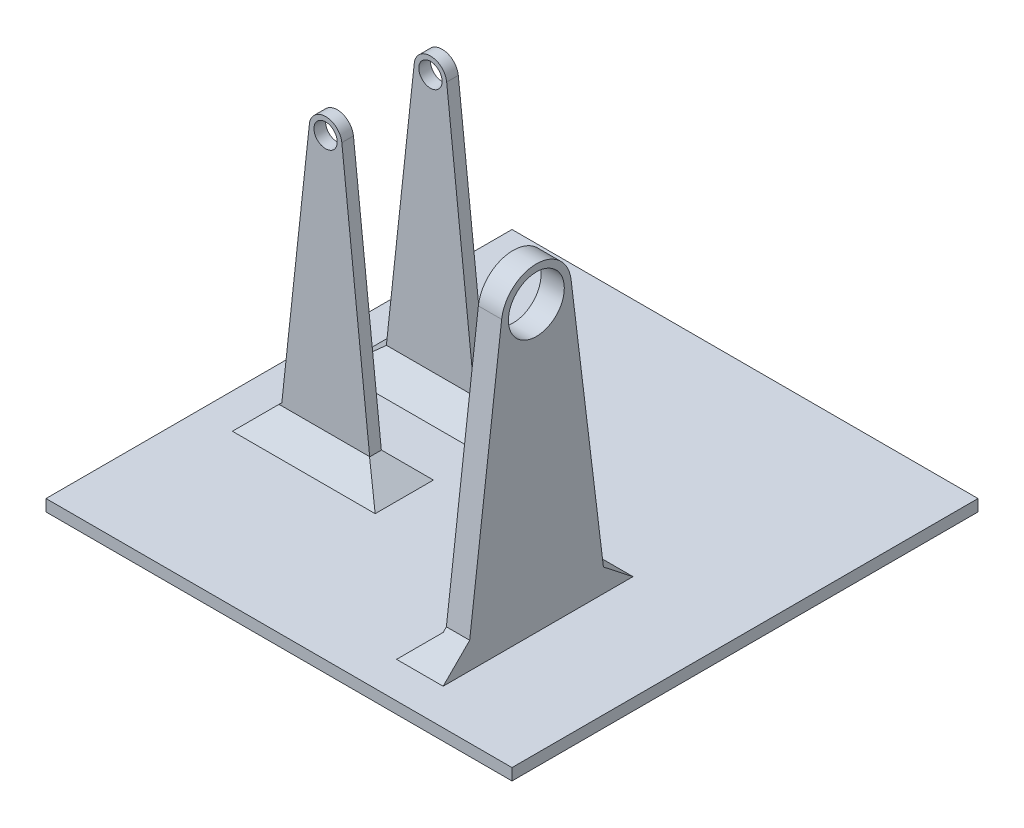
ISO-10303-21;
HEADER;
FILE_DESCRIPTION(('STEP AP214'),'2;1');
FILE_NAME('part.step','',(''),(''),'','','');
FILE_SCHEMA(('AUTOMOTIVE_DESIGN { 1 0 10303 214 1 1 1 1 }'));
ENDSEC;
DATA;
#1=APPLICATION_CONTEXT('core data for automotive mechanical design processes');
#2=APPLICATION_PROTOCOL_DEFINITION('international standard','automotive_design',2000,#1);
#3=PRODUCT_CONTEXT('',#1,'mechanical');
#4=PRODUCT('Part','Part','',(#3));
#5=PRODUCT_RELATED_PRODUCT_CATEGORY('part','',(#4));
#6=PRODUCT_DEFINITION_FORMATION('','',#4);
#7=PRODUCT_DEFINITION_CONTEXT('part definition',#1,'design');
#8=PRODUCT_DEFINITION('design','',#6,#7);
#9=PRODUCT_DEFINITION_SHAPE('','',#8);
#10=(LENGTH_UNIT() NAMED_UNIT(*) SI_UNIT(.MILLI.,.METRE.));
#11=(NAMED_UNIT(*) PLANE_ANGLE_UNIT() SI_UNIT($,.RADIAN.));
#12=(NAMED_UNIT(*) SI_UNIT($,.STERADIAN.) SOLID_ANGLE_UNIT());
#13=UNCERTAINTY_MEASURE_WITH_UNIT(LENGTH_MEASURE(1.E-05),#10,'distance_accuracy_value','');
#14=(GEOMETRIC_REPRESENTATION_CONTEXT(3) GLOBAL_UNCERTAINTY_ASSIGNED_CONTEXT((#13)) GLOBAL_UNIT_ASSIGNED_CONTEXT((#10,
#11,#12)) REPRESENTATION_CONTEXT('',''));
#15=CARTESIAN_POINT('',(0.,0.,0.));
#16=DIRECTION('',(0.,0.,1.));
#17=DIRECTION('',(1.,0.,0.));
#18=AXIS2_PLACEMENT_3D('',#15,#16,#17);
#19=CARTESIAN_POINT('',(0.,5.,0.));
#20=DIRECTION('',(0.,1.,0.));
#21=DIRECTION('',(0.,0.,1.));
#22=AXIS2_PLACEMENT_3D('',#19,#20,#21);
#23=PLANE('',#22);
#24=DIRECTION('',(0.,0.,1.));
#25=VECTOR('',#24,1.);
#26=CARTESIAN_POINT('',(118.507957149337,5.,5.22953330592103));
#27=LINE('',#26,#25);
#28=CARTESIAN_POINT('',(118.507957149337,5.,-9.77046669407893));
#29=VERTEX_POINT('',#28);
#30=CARTESIAN_POINT('',(118.507957149337,5.,15.2295333059211));
#31=VERTEX_POINT('',#30);
#32=EDGE_CURVE('E422',#29,#31,#27,.T.);
#33=ORIENTED_EDGE('',*,*,#32,.T.);
#34=DIRECTION('',(-1.,0.,0.));
#35=VECTOR('',#34,1.);
#36=CARTESIAN_POINT('',(0.,5.,15.2295333059211));
#37=LINE('',#36,#35);
#38=CARTESIAN_POINT('',(57.232084105509,5.,15.2295333059211));
#39=VERTEX_POINT('',#38);
#40=EDGE_CURVE('E431',#31,#39,#37,.T.);
#41=ORIENTED_EDGE('',*,*,#40,.T.);
#42=DIRECTION('',(0.,0.,-1.));
#43=VECTOR('',#42,1.);
#44=CARTESIAN_POINT('',(57.232084105509,5.,0.));
#45=LINE('',#44,#43);
#46=CARTESIAN_POINT('',(57.232084105509,5.,-9.77046669407893));
#47=VERTEX_POINT('',#46);
#48=EDGE_CURVE('E428',#39,#47,#45,.T.);
#49=ORIENTED_EDGE('',*,*,#48,.T.);
#50=DIRECTION('',(1.,0.,0.));
#51=VECTOR('',#50,1.);
#52=CARTESIAN_POINT('',(108.507957149337,5.,-9.77046669407893));
#53=LINE('',#52,#51);
#54=EDGE_CURVE('E425',#47,#29,#53,.T.);
#55=ORIENTED_EDGE('',*,*,#54,.T.);
#56=EDGE_LOOP('',(#33,#41,#49,#55));
#57=FACE_BOUND('',#56,.T.);
#58=DIRECTION('',(0.,0.,-1.));
#59=VECTOR('',#58,1.);
#60=CARTESIAN_POINT('',(58.5079571493369,5.,45.229533305921));
#61=LINE('',#60,#59);
#62=CARTESIAN_POINT('',(58.5079571493369,5.,60.2295333059211));
#63=VERTEX_POINT('',#62);
#64=CARTESIAN_POINT('',(58.5079571493369,5.,35.2295333059211));
#65=VERTEX_POINT('',#64);
#66=EDGE_CURVE('E415',#63,#65,#61,.T.);
#67=ORIENTED_EDGE('',*,*,#66,.T.);
#68=DIRECTION('',(1.,0.,0.));
#69=VECTOR('',#68,1.);
#70=CARTESIAN_POINT('',(0.,5.,35.2295333059211));
#71=LINE('',#70,#69);
#72=CARTESIAN_POINT('',(119.783830193165,5.,35.2295333059211));
#73=VERTEX_POINT('',#72);
#74=EDGE_CURVE('E418',#65,#73,#71,.T.);
#75=ORIENTED_EDGE('',*,*,#74,.T.);
#76=DIRECTION('',(0.,0.,1.));
#77=VECTOR('',#76,1.);
#78=CARTESIAN_POINT('',(119.783830193165,5.,0.));
#79=LINE('',#78,#77);
#80=CARTESIAN_POINT('',(119.783830193165,5.,60.2295333059211));
#81=VERTEX_POINT('',#80);
#82=EDGE_CURVE('E412',#73,#81,#79,.T.);
#83=ORIENTED_EDGE('',*,*,#82,.T.);
#84=DIRECTION('',(-1.,0.,0.));
#85=VECTOR('',#84,1.);
#86=CARTESIAN_POINT('',(68.5079571493369,5.,60.2295333059211));
#87=LINE('',#86,#85);
#88=EDGE_CURVE('E409',#81,#63,#87,.T.);
#89=ORIENTED_EDGE('',*,*,#88,.T.);
#90=EDGE_LOOP('',(#67,#75,#83,#89));
#91=FACE_BOUND('',#90,.T.);
#92=DIRECTION('',(0.,0.,-1.));
#93=VECTOR('',#92,1.);
#94=CARTESIAN_POINT('',(43.5079571493369,5.,-74.770466694079));
#95=LINE('',#94,#93);
#96=CARTESIAN_POINT('',(43.5079571493369,5.,125.229533305921));
#97=VERTEX_POINT('',#96);
#98=CARTESIAN_POINT('',(43.5079571493369,5.,-74.770466694079));
#99=VERTEX_POINT('',#98);
#100=EDGE_CURVE('E387',#97,#99,#95,.T.);
#101=ORIENTED_EDGE('',*,*,#100,.F.);
#102=DIRECTION('',(1.,0.,0.));
#103=VECTOR('',#102,1.);
#104=CARTESIAN_POINT('',(43.5079571493369,5.,125.229533305921));
#105=LINE('',#104,#103);
#106=CARTESIAN_POINT('',(243.507957149337,5.,125.229533305921));
#107=VERTEX_POINT('',#106);
#108=EDGE_CURVE('E366',#97,#107,#105,.T.);
#109=ORIENTED_EDGE('',*,*,#108,.T.);
#110=DIRECTION('',(0.,0.,-1.));
#111=VECTOR('',#110,1.);
#112=CARTESIAN_POINT('',(243.507957149337,5.,-74.770466694079));
#113=LINE('',#112,#111);
#114=CARTESIAN_POINT('',(243.507957149337,5.,-74.770466694079));
#115=VERTEX_POINT('',#114);
#116=EDGE_CURVE('E374',#107,#115,#113,.T.);
#117=ORIENTED_EDGE('',*,*,#116,.T.);
#118=DIRECTION('',(-1.,0.,0.));
#119=VECTOR('',#118,1.);
#120=CARTESIAN_POINT('',(120.27471536396,5.,-74.770466694079));
#121=LINE('',#120,#119);
#122=EDGE_CURVE('E398',#115,#99,#121,.T.);
#123=ORIENTED_EDGE('',*,*,#122,.T.);
#124=EDGE_LOOP('',(#101,#109,#117,#123));
#125=FACE_BOUND('',#124,.T.);
#126=DIRECTION('',(-1.,0.,0.));
#127=VECTOR('',#126,1.);
#128=CARTESIAN_POINT('',(188.507957149337,5.,109.779533305921));
#129=LINE('',#128,#127);
#130=CARTESIAN_POINT('',(198.507957149337,5.,109.779533305921));
#131=VERTEX_POINT('',#130);
#132=CARTESIAN_POINT('',(178.507957149337,5.,109.779533305921));
#133=VERTEX_POINT('',#132);
#134=EDGE_CURVE('E76',#131,#133,#129,.T.);
#135=ORIENTED_EDGE('',*,*,#134,.T.);
#136=DIRECTION('',(0.,0.,-1.));
#137=VECTOR('',#136,1.);
#138=CARTESIAN_POINT('',(178.507957149337,5.,0.));
#139=LINE('',#138,#137);
#140=CARTESIAN_POINT('',(178.507957149337,5.,28.3050058570068));
#141=VERTEX_POINT('',#140);
#142=EDGE_CURVE('E537',#133,#141,#139,.T.);
#143=ORIENTED_EDGE('',*,*,#142,.T.);
#144=DIRECTION('',(1.,0.,0.));
#145=VECTOR('',#144,1.);
#146=CARTESIAN_POINT('',(0.,5.,28.3050058570069));
#147=LINE('',#146,#145);
#148=CARTESIAN_POINT('',(198.507957149337,5.,28.3050058570068));
#149=VERTEX_POINT('',#148);
#150=EDGE_CURVE('E435',#141,#149,#147,.T.);
#151=ORIENTED_EDGE('',*,*,#150,.T.);
#152=DIRECTION('',(0.,0.,1.));
#153=VECTOR('',#152,1.);
#154=CARTESIAN_POINT('',(198.507957149337,5.,0.));
#155=LINE('',#154,#153);
#156=EDGE_CURVE('E279',#149,#131,#155,.T.);
#157=ORIENTED_EDGE('',*,*,#156,.T.);
#158=EDGE_LOOP('',(#135,#143,#151,#157));
#159=FACE_BOUND('',#158,.T.);
#160=ADVANCED_FACE('F52',(#57,#91,#125,#159),#23,.T.);
#161=CARTESIAN_POINT('',(0.,0.,0.));
#162=DIRECTION('',(0.,1.,0.));
#163=DIRECTION('',(0.,0.,1.));
#164=AXIS2_PLACEMENT_3D('',#161,#162,#163);
#165=PLANE('',#164);
#166=DIRECTION('',(-1.,0.,0.));
#167=VECTOR('',#166,1.);
#168=CARTESIAN_POINT('',(43.5079571493369,0.,125.229533305921));
#169=LINE('',#168,#167);
#170=CARTESIAN_POINT('',(243.507957149337,0.,125.229533305921));
#171=VERTEX_POINT('',#170);
#172=CARTESIAN_POINT('',(43.5079571493369,-1.11022302462516E-13,125.229533305921));
#173=VERTEX_POINT('',#172);
#174=EDGE_CURVE('E370',#171,#173,#169,.T.);
#175=ORIENTED_EDGE('',*,*,#174,.T.);
#176=DIRECTION('',(0.,0.,-1.));
#177=VECTOR('',#176,1.);
#178=CARTESIAN_POINT('',(43.5079571493369,0.,0.));
#179=LINE('',#178,#177);
#180=CARTESIAN_POINT('',(43.5079571493369,0.,-74.770466694079));
#181=VERTEX_POINT('',#180);
#182=EDGE_CURVE('E394',#173,#181,#179,.T.);
#183=ORIENTED_EDGE('',*,*,#182,.T.);
#184=DIRECTION('',(-1.,0.,0.));
#185=VECTOR('',#184,1.);
#186=CARTESIAN_POINT('',(120.27471536396,0.,-74.770466694079));
#187=LINE('',#186,#185);
#188=CARTESIAN_POINT('',(243.507957149337,0.,-74.770466694079));
#189=VERTEX_POINT('',#188);
#190=EDGE_CURVE('E397',#189,#181,#187,.T.);
#191=ORIENTED_EDGE('',*,*,#190,.F.);
#192=DIRECTION('',(0.,0.,1.));
#193=VECTOR('',#192,1.);
#194=CARTESIAN_POINT('',(243.507957149337,0.,-74.770466694079));
#195=LINE('',#194,#193);
#196=EDGE_CURVE('E367',#189,#171,#195,.T.);
#197=ORIENTED_EDGE('',*,*,#196,.T.);
#198=EDGE_LOOP('',(#175,#183,#191,#197));
#199=FACE_BOUND('',#198,.T.);
#200=ADVANCED_FACE('F560',(#199),#165,.F.);
#201=CARTESIAN_POINT('',(43.5079571493369,-5.,-74.770466694079));
#202=DIRECTION('',(1.,0.,0.));
#203=DIRECTION('',(0.,0.,-1.));
#204=AXIS2_PLACEMENT_3D('',#201,#202,#203);
#205=PLANE('',#204);
#206=DIRECTION('',(0.,1.,0.));
#207=VECTOR('',#206,1.);
#208=CARTESIAN_POINT('',(43.5079571493369,-1.11022302462516E-13,125.229533305921));
#209=LINE('',#208,#207);
#210=EDGE_CURVE('E360',#173,#97,#209,.T.);
#211=ORIENTED_EDGE('',*,*,#210,.T.);
#212=ORIENTED_EDGE('',*,*,#100,.T.);
#213=DIRECTION('',(0.,1.,0.));
#214=VECTOR('',#213,1.);
#215=CARTESIAN_POINT('',(43.5079571493369,-5.,-74.770466694079));
#216=LINE('',#215,#214);
#217=EDGE_CURVE('E390',#181,#99,#216,.T.);
#218=ORIENTED_EDGE('',*,*,#217,.F.);
#219=ORIENTED_EDGE('',*,*,#182,.F.);
#220=EDGE_LOOP('',(#211,#212,#218,#219));
#221=FACE_BOUND('',#220,.T.);
#222=ADVANCED_FACE('F568',(#221),#205,.F.);
#223=CARTESIAN_POINT('',(120.27471536396,5.,-74.770466694079));
#224=DIRECTION('',(0.,0.,1.));
#225=DIRECTION('',(1.,0.,0.));
#226=AXIS2_PLACEMENT_3D('',#223,#224,#225);
#227=PLANE('',#226);
#228=ORIENTED_EDGE('',*,*,#190,.T.);
#229=ORIENTED_EDGE('',*,*,#217,.T.);
#230=ORIENTED_EDGE('',*,*,#122,.F.);
#231=DIRECTION('',(0.,1.,0.));
#232=VECTOR('',#231,1.);
#233=CARTESIAN_POINT('',(243.507957149337,-282.842712474619,-74.770466694079));
#234=LINE('',#233,#232);
#235=EDGE_CURVE('E371',#189,#115,#234,.T.);
#236=ORIENTED_EDGE('',*,*,#235,.F.);
#237=EDGE_LOOP('',(#228,#229,#230,#236));
#238=FACE_BOUND('',#237,.T.);
#239=ADVANCED_FACE('F575',(#238),#227,.F.);
#240=CARTESIAN_POINT('',(243.507957149337,-282.842712474619,-74.770466694079));
#241=DIRECTION('',(1.,0.,0.));
#242=DIRECTION('',(0.,0.,-1.));
#243=AXIS2_PLACEMENT_3D('',#240,#241,#242);
#244=PLANE('',#243);
#245=ORIENTED_EDGE('',*,*,#196,.F.);
#246=ORIENTED_EDGE('',*,*,#235,.T.);
#247=ORIENTED_EDGE('',*,*,#116,.F.);
#248=DIRECTION('',(0.,1.,0.));
#249=VECTOR('',#248,1.);
#250=CARTESIAN_POINT('',(243.507957149337,-282.842712474619,125.229533305921));
#251=LINE('',#250,#249);
#252=EDGE_CURVE('E378',#171,#107,#251,.T.);
#253=ORIENTED_EDGE('',*,*,#252,.F.);
#254=EDGE_LOOP('',(#245,#246,#247,#253));
#255=FACE_BOUND('',#254,.T.);
#256=ADVANCED_FACE('F578',(#255),#244,.T.);
#257=CARTESIAN_POINT('',(43.5079571493369,-282.842712474619,125.229533305921));
#258=DIRECTION('',(0.,0.,1.));
#259=DIRECTION('',(1.,0.,0.));
#260=AXIS2_PLACEMENT_3D('',#257,#258,#259);
#261=PLANE('',#260);
#262=ORIENTED_EDGE('',*,*,#108,.F.);
#263=ORIENTED_EDGE('',*,*,#210,.F.);
#264=ORIENTED_EDGE('',*,*,#174,.F.);
#265=ORIENTED_EDGE('',*,*,#252,.T.);
#266=EDGE_LOOP('',(#262,#263,#264,#265));
#267=FACE_BOUND('',#266,.T.);
#268=ADVANCED_FACE('F703',(#267),#261,.T.);
#269=CARTESIAN_POINT('',(107.790792186413,11.6407756499079,45.229533305921));
#270=DIRECTION('',(-0.994219147675538,-0.107369857945923,0.));
#271=DIRECTION('',(0.107369857945923,-0.994219147675538,0.));
#272=AXIS2_PLACEMENT_3D('',#269,#270,#271);
#273=PLANE('',#272);
#274=DIRECTION('',(0.107369857945923,-0.994219147675538,0.));
#275=VECTOR('',#274,1.);
#276=CARTESIAN_POINT('',(107.790792186413,11.6407756499079,50.229533305921));
#277=LINE('',#276,#275);
#278=CARTESIAN_POINT('',(95.4674911830656,125.751589005621,50.229533305921));
#279=VERTEX_POINT('',#278);
#280=CARTESIAN_POINT('',(107.428015587188,15.,50.229533305921));
#281=VERTEX_POINT('',#280);
#282=EDGE_CURVE('E321',#279,#281,#277,.T.);
#283=ORIENTED_EDGE('',*,*,#282,.T.);
#284=DIRECTION('',(-0.0761417176746589,0.70505405425029,-0.705054054250298));
#285=VECTOR('',#284,1.);
#286=CARTESIAN_POINT('',(107.342035362842,15.7961562677004,49.4333770382206));
#287=LINE('',#286,#285);
#288=CARTESIAN_POINT('',(107.434258569878,14.9421914767553,50.2873418291657));
#289=VERTEX_POINT('',#288);
#290=EDGE_CURVE('E501',#281,#289,#287,.F.);
#291=ORIENTED_EDGE('',*,*,#290,.T.);
#292=DIRECTION('',(0.,0.,-1.));
#293=VECTOR('',#292,1.);
#294=CARTESIAN_POINT('',(107.434258569878,14.9421914767553,45.229533305921));
#295=LINE('',#294,#293);
#296=CARTESIAN_POINT('',(107.434258569878,14.9421914767553,45.1717247826762));
#297=VERTEX_POINT('',#296);
#298=EDGE_CURVE('E461',#289,#297,#295,.T.);
#299=ORIENTED_EDGE('',*,*,#298,.T.);
#300=DIRECTION('',(-0.0761417176746597,0.705054054250298,0.70505405425029));
#301=VECTOR('',#300,1.);
#302=CARTESIAN_POINT('',(107.610455496563,13.3106501706265,43.5401834765475));
#303=LINE('',#302,#301);
#304=CARTESIAN_POINT('',(107.428015587188,15.0000000000001,45.229533305921));
#305=VERTEX_POINT('',#304);
#306=EDGE_CURVE('E491',#297,#305,#303,.T.);
#307=ORIENTED_EDGE('',*,*,#306,.T.);
#308=DIRECTION('',(0.107369857945923,-0.994219147675538,0.));
#309=VECTOR('',#308,1.);
#310=CARTESIAN_POINT('',(107.790792186413,11.6407756499079,45.229533305921));
#311=LINE('',#310,#309);
#312=CARTESIAN_POINT('',(95.4674911830656,125.751589005621,45.229533305921));
#313=VERTEX_POINT('',#312);
#314=EDGE_CURVE('E325',#313,#305,#311,.T.);
#315=ORIENTED_EDGE('',*,*,#314,.F.);
#316=DIRECTION('',(0.,0.,1.));
#317=VECTOR('',#316,1.);
#318=CARTESIAN_POINT('',(95.4674911830656,125.751589005621,45.229533305921));
#319=LINE('',#318,#317);
#320=EDGE_CURVE('E342',#313,#279,#319,.T.);
#321=ORIENTED_EDGE('',*,*,#320,.T.);
#322=EDGE_LOOP('',(#283,#291,#299,#307,#315,#321));
#323=FACE_BOUND('',#322,.T.);
#324=ADVANCED_FACE('F661',(#323),#273,.F.);
#325=CARTESIAN_POINT('',(67.1844319556953,-7.25552603983309,45.229533305921));
#326=DIRECTION('',(-0.994219147675538,0.107369857945923,0.));
#327=DIRECTION('',(-0.107369857945923,-0.994219147675538,0.));
#328=AXIS2_PLACEMENT_3D('',#325,#326,#327);
#329=PLANE('',#328);
#330=DIRECTION('',(-0.107369857945923,-0.994219147675538,0.));
#331=VECTOR('',#330,1.);
#332=CARTESIAN_POINT('',(67.1844319556953,-7.25552603983309,45.229533305921));
#333=LINE('',#332,#331);
#334=CARTESIAN_POINT('',(81.5484231156081,125.751589005621,45.229533305921));
#335=VERTEX_POINT('',#334);
#336=CARTESIAN_POINT('',(69.7186460362689,16.2106888869321,45.229533305921));
#337=VERTEX_POINT('',#336);
#338=EDGE_CURVE('E334',#335,#337,#333,.T.);
#339=ORIENTED_EDGE('',*,*,#338,.T.);
#340=DIRECTION('',(0.,0.,1.));
#341=VECTOR('',#340,1.);
#342=CARTESIAN_POINT('',(69.7186460362689,16.2106888869321,50.229533305921));
#343=LINE('',#342,#341);
#344=CARTESIAN_POINT('',(69.7186460362689,16.2106888869321,50.229533305921));
#345=VERTEX_POINT('',#344);
#346=EDGE_CURVE('E458',#337,#345,#343,.T.);
#347=ORIENTED_EDGE('',*,*,#346,.T.);
#348=DIRECTION('',(-0.107369857945923,-0.994219147675538,0.));
#349=VECTOR('',#348,1.);
#350=CARTESIAN_POINT('',(67.1844319556953,-7.25552603983309,50.229533305921));
#351=LINE('',#350,#349);
#352=CARTESIAN_POINT('',(81.5484231156081,125.751589005621,50.229533305921));
#353=VERTEX_POINT('',#352);
#354=EDGE_CURVE('E350',#353,#345,#351,.T.);
#355=ORIENTED_EDGE('',*,*,#354,.F.);
#356=DIRECTION('',(0.,0.,1.));
#357=VECTOR('',#356,1.);
#358=CARTESIAN_POINT('',(81.5484231156081,125.751589005621,45.229533305921));
#359=LINE('',#358,#357);
#360=EDGE_CURVE('E357',#335,#353,#359,.T.);
#361=ORIENTED_EDGE('',*,*,#360,.F.);
#362=EDGE_LOOP('',(#339,#347,#355,#361));
#363=FACE_BOUND('',#362,.T.);
#364=ADVANCED_FACE('F674',(#363),#329,.T.);
#365=CARTESIAN_POINT('',(88.5079571493369,125.,45.229533305921));
#366=DIRECTION('',(0.,0.,1.));
#367=DIRECTION('',(1.,0.,0.));
#368=AXIS2_PLACEMENT_3D('',#365,#366,#367);
#369=CYLINDRICAL_SURFACE('',#368,7.);
#370=CARTESIAN_POINT('',(88.5079571493369,125.,50.229533305921));
#371=DIRECTION('',(0.,0.,1.));
#372=DIRECTION('',(1.,0.,0.));
#373=AXIS2_PLACEMENT_3D('',#370,#371,#372);
#374=CIRCLE('',#373,7.);
#375=EDGE_CURVE('E346',#279,#353,#374,.T.);
#376=ORIENTED_EDGE('',*,*,#375,.F.);
#377=ORIENTED_EDGE('',*,*,#320,.F.);
#378=CARTESIAN_POINT('',(88.5079571493369,125.,45.229533305921));
#379=DIRECTION('',(0.,0.,1.));
#380=DIRECTION('',(1.,0.,0.));
#381=AXIS2_PLACEMENT_3D('',#378,#379,#380);
#382=CIRCLE('',#381,7.);
#383=EDGE_CURVE('E329',#313,#335,#382,.T.);
#384=ORIENTED_EDGE('',*,*,#383,.T.);
#385=ORIENTED_EDGE('',*,*,#360,.T.);
#386=EDGE_LOOP('',(#376,#377,#384,#385));
#387=FACE_BOUND('',#386,.T.);
#388=ADVANCED_FACE('F669',(#387),#369,.T.);
#389=CARTESIAN_POINT('',(88.5079571493369,125.,45.229533305921));
#390=DIRECTION('',(0.,0.,1.));
#391=DIRECTION('',(1.,0.,0.));
#392=AXIS2_PLACEMENT_3D('',#389,#390,#391);
#393=CYLINDRICAL_SURFACE('',#392,5.00000000000001);
#394=CARTESIAN_POINT('',(88.5079571493369,125.,45.229533305921));
#395=DIRECTION('',(0.,0.,1.));
#396=DIRECTION('',(1.,0.,0.));
#397=AXIS2_PLACEMENT_3D('',#394,#395,#396);
#398=CIRCLE('',#397,5.00000000000001);
#399=CARTESIAN_POINT('',(93.5079571493369,125.,45.229533305921));
#400=VERTEX_POINT('',#399);
#401=EDGE_CURVE('E338',#400,#400,#398,.T.);
#402=ORIENTED_EDGE('',*,*,#401,.F.);
#403=EDGE_LOOP('',(#402));
#404=FACE_BOUND('',#403,.T.);
#405=CARTESIAN_POINT('',(88.5079571493369,125.,50.229533305921));
#406=DIRECTION('',(0.,0.,1.));
#407=DIRECTION('',(1.,0.,0.));
#408=AXIS2_PLACEMENT_3D('',#405,#406,#407);
#409=CIRCLE('',#408,5.00000000000001);
#410=CARTESIAN_POINT('',(93.5079571493369,125.,50.229533305921));
#411=VERTEX_POINT('',#410);
#412=EDGE_CURVE('E330',#411,#411,#409,.T.);
#413=ORIENTED_EDGE('',*,*,#412,.T.);
#414=EDGE_LOOP('',(#413));
#415=FACE_BOUND('',#414,.T.);
#416=ADVANCED_FACE('F679',(#404,#415),#393,.F.);
#417=CARTESIAN_POINT('',(0.,0.,45.229533305921));
#418=DIRECTION('',(0.,0.,1.));
#419=DIRECTION('',(1.,0.,0.));
#420=AXIS2_PLACEMENT_3D('',#417,#418,#419);
#421=PLANE('',#420);
#422=ORIENTED_EDGE('',*,*,#314,.T.);
#423=DIRECTION('',(-1.,0.,0.));
#424=VECTOR('',#423,1.);
#425=CARTESIAN_POINT('',(0.,15.0000000000001,45.229533305921));
#426=LINE('',#425,#424);
#427=CARTESIAN_POINT('',(68.5079571493369,15.0000000000001,45.229533305921));
#428=VERTEX_POINT('',#427);
#429=EDGE_CURVE('E455',#305,#428,#426,.T.);
#430=ORIENTED_EDGE('',*,*,#429,.T.);
#431=DIRECTION('',(-0.707106781186543,-0.707106781186552,0.));
#432=VECTOR('',#431,1.);
#433=CARTESIAN_POINT('',(26.7539785746688,-26.7539785746685,45.229533305921));
#434=LINE('',#433,#432);
#435=EDGE_CURVE('E498',#428,#337,#434,.F.);
#436=ORIENTED_EDGE('',*,*,#435,.T.);
#437=ORIENTED_EDGE('',*,*,#338,.F.);
#438=ORIENTED_EDGE('',*,*,#383,.F.);
#439=EDGE_LOOP('',(#422,#430,#436,#437,#438));
#440=FACE_BOUND('',#439,.T.);
#441=ORIENTED_EDGE('',*,*,#401,.T.);
#442=EDGE_LOOP('',(#441));
#443=FACE_BOUND('',#442,.T.);
#444=ADVANCED_FACE('F676',(#440,#443),#421,.F.);
#445=CARTESIAN_POINT('',(0.,0.,50.229533305921));
#446=DIRECTION('',(0.,0.,1.));
#447=DIRECTION('',(1.,0.,0.));
#448=AXIS2_PLACEMENT_3D('',#445,#446,#447);
#449=PLANE('',#448);
#450=DIRECTION('',(0.707106781186543,0.707106781186552,0.));
#451=VECTOR('',#450,1.);
#452=CARTESIAN_POINT('',(69.7186460362689,16.2106888869321,50.229533305921));
#453=LINE('',#452,#451);
#454=CARTESIAN_POINT('',(68.5079571493368,15.,50.229533305921));
#455=VERTEX_POINT('',#454);
#456=EDGE_CURVE('E494',#345,#455,#453,.F.);
#457=ORIENTED_EDGE('',*,*,#456,.T.);
#458=DIRECTION('',(1.,0.,0.));
#459=VECTOR('',#458,1.);
#460=CARTESIAN_POINT('',(108.507957149337,15.,50.229533305921));
#461=LINE('',#460,#459);
#462=EDGE_CURVE('E464',#455,#281,#461,.T.);
#463=ORIENTED_EDGE('',*,*,#462,.T.);
#464=ORIENTED_EDGE('',*,*,#282,.F.);
#465=ORIENTED_EDGE('',*,*,#375,.T.);
#466=ORIENTED_EDGE('',*,*,#354,.T.);
#467=EDGE_LOOP('',(#457,#463,#464,#465,#466));
#468=FACE_BOUND('',#467,.T.);
#469=ORIENTED_EDGE('',*,*,#412,.F.);
#470=EDGE_LOOP('',(#469));
#471=FACE_BOUND('',#470,.T.);
#472=ADVANCED_FACE('F666',(#468,#471),#449,.T.);
#473=CARTESIAN_POINT('',(107.790792186413,11.6407756499079,5.22953330592103));
#474=DIRECTION('',(0.994219147675538,0.107369857945923,0.));
#475=DIRECTION('',(-0.107369857945923,0.994219147675538,0.));
#476=AXIS2_PLACEMENT_3D('',#473,#474,#475);
#477=PLANE('',#476);
#478=DIRECTION('',(0.107369857945923,-0.994219147675538,0.));
#479=VECTOR('',#478,1.);
#480=CARTESIAN_POINT('',(107.790792186413,11.6407756499079,5.22953330592103));
#481=LINE('',#480,#479);
#482=CARTESIAN_POINT('',(95.4674911830656,125.751589005621,5.22953330592103));
#483=VERTEX_POINT('',#482);
#484=CARTESIAN_POINT('',(107.297268262405,16.210688886932,5.22953330592103));
#485=VERTEX_POINT('',#484);
#486=EDGE_CURVE('E288',#483,#485,#481,.T.);
#487=ORIENTED_EDGE('',*,*,#486,.T.);
#488=DIRECTION('',(0.,0.,-1.));
#489=VECTOR('',#488,1.);
#490=CARTESIAN_POINT('',(107.297268262405,16.210688886932,0.229533305921029));
#491=LINE('',#490,#489);
#492=CARTESIAN_POINT('',(107.297268262405,16.210688886932,0.229533305921029));
#493=VERTEX_POINT('',#492);
#494=EDGE_CURVE('E452',#485,#493,#491,.T.);
#495=ORIENTED_EDGE('',*,*,#494,.T.);
#496=DIRECTION('',(0.107369857945923,-0.994219147675538,0.));
#497=VECTOR('',#496,1.);
#498=CARTESIAN_POINT('',(107.790792186413,11.6407756499079,0.229533305921029));
#499=LINE('',#498,#497);
#500=CARTESIAN_POINT('',(95.4674911830656,125.751589005621,0.229533305921029));
#501=VERTEX_POINT('',#500);
#502=EDGE_CURVE('E286',#501,#493,#499,.T.);
#503=ORIENTED_EDGE('',*,*,#502,.F.);
#504=DIRECTION('',(0.,0.,-1.));
#505=VECTOR('',#504,1.);
#506=CARTESIAN_POINT('',(95.4674911830656,125.751589005621,5.22953330592103));
#507=LINE('',#506,#505);
#508=EDGE_CURVE('E318',#483,#501,#507,.T.);
#509=ORIENTED_EDGE('',*,*,#508,.F.);
#510=EDGE_LOOP('',(#487,#495,#503,#509));
#511=FACE_BOUND('',#510,.T.);
#512=ADVANCED_FACE('F688',(#511),#477,.T.);
#513=CARTESIAN_POINT('',(88.5079571493369,125.,5.22953330592103));
#514=DIRECTION('',(0.,0.,-1.));
#515=DIRECTION('',(-1.,0.,0.));
#516=AXIS2_PLACEMENT_3D('',#513,#514,#515);
#517=CYLINDRICAL_SURFACE('',#516,7.);
#518=CARTESIAN_POINT('',(88.5079571493369,125.,0.229533305921029));
#519=DIRECTION('',(0.,0.,1.));
#520=DIRECTION('',(1.,0.,0.));
#521=AXIS2_PLACEMENT_3D('',#518,#519,#520);
#522=CIRCLE('',#521,7.);
#523=CARTESIAN_POINT('',(81.5484231156081,125.751589005621,0.229533305921029));
#524=VERTEX_POINT('',#523);
#525=EDGE_CURVE('E312',#501,#524,#522,.T.);
#526=ORIENTED_EDGE('',*,*,#525,.T.);
#527=DIRECTION('',(0.,0.,-1.));
#528=VECTOR('',#527,1.);
#529=CARTESIAN_POINT('',(81.5484231156081,125.751589005621,5.22953330592103));
#530=LINE('',#529,#528);
#531=CARTESIAN_POINT('',(81.5484231156081,125.751589005621,5.22953330592103));
#532=VERTEX_POINT('',#531);
#533=EDGE_CURVE('E304',#532,#524,#530,.T.);
#534=ORIENTED_EDGE('',*,*,#533,.F.);
#535=CARTESIAN_POINT('',(88.5079571493369,125.,5.22953330592103));
#536=DIRECTION('',(0.,0.,1.));
#537=DIRECTION('',(1.,0.,0.));
#538=AXIS2_PLACEMENT_3D('',#535,#536,#537);
#539=CIRCLE('',#538,7.);
#540=EDGE_CURVE('E297',#483,#532,#539,.T.);
#541=ORIENTED_EDGE('',*,*,#540,.F.);
#542=ORIENTED_EDGE('',*,*,#508,.T.);
#543=EDGE_LOOP('',(#526,#534,#541,#542));
#544=FACE_BOUND('',#543,.T.);
#545=ADVANCED_FACE('F693',(#544),#517,.T.);
#546=CARTESIAN_POINT('',(67.1844319556953,-7.25552603983309,5.22953330592103));
#547=DIRECTION('',(0.994219147675538,-0.107369857945923,0.));
#548=DIRECTION('',(0.107369857945923,0.994219147675538,0.));
#549=AXIS2_PLACEMENT_3D('',#546,#547,#548);
#550=PLANE('',#549);
#551=DIRECTION('',(-0.107369857945923,-0.994219147675538,0.));
#552=VECTOR('',#551,1.);
#553=CARTESIAN_POINT('',(67.1844319556953,-7.25552603983309,0.229533305921029));
#554=LINE('',#553,#552);
#555=CARTESIAN_POINT('',(69.5878987114859,15.0000000000001,0.229533305921029));
#556=VERTEX_POINT('',#555);
#557=EDGE_CURVE('E308',#524,#556,#554,.T.);
#558=ORIENTED_EDGE('',*,*,#557,.T.);
#559=DIRECTION('',(0.0761417176746596,0.705054054250298,0.70505405425029));
#560=VECTOR('',#559,1.);
#561=CARTESIAN_POINT('',(68.6476183445422,6.29322919035903,-8.4772375037199));
#562=LINE('',#561,#560);
#563=CARTESIAN_POINT('',(69.5816557287961,14.9421914767553,0.171724782676253));
#564=VERTEX_POINT('',#563);
#565=EDGE_CURVE('E480',#556,#564,#562,.F.);
#566=ORIENTED_EDGE('',*,*,#565,.T.);
#567=DIRECTION('',(0.,0.,1.));
#568=VECTOR('',#567,1.);
#569=CARTESIAN_POINT('',(69.5816557287961,14.9421914767553,5.22953330592103));
#570=LINE('',#569,#568);
#571=CARTESIAN_POINT('',(69.5816557287961,14.9421914767553,5.2873418291657));
#572=VERTEX_POINT('',#571);
#573=EDGE_CURVE('E446',#564,#572,#570,.T.);
#574=ORIENTED_EDGE('',*,*,#573,.T.);
#575=DIRECTION('',(0.0761417176746587,0.70505405425029,-0.705054054250298));
#576=VECTOR('',#575,1.);
#577=CARTESIAN_POINT('',(68.3791982108217,3.80772309328534,16.4218102126358));
#578=LINE('',#577,#576);
#579=CARTESIAN_POINT('',(69.5878987114859,15.,5.22953330592103));
#580=VERTEX_POINT('',#579);
#581=EDGE_CURVE('E477',#572,#580,#578,.T.);
#582=ORIENTED_EDGE('',*,*,#581,.T.);
#583=DIRECTION('',(-0.107369857945923,-0.994219147675538,0.));
#584=VECTOR('',#583,1.);
#585=CARTESIAN_POINT('',(67.1844319556953,-7.25552603983309,5.22953330592103));
#586=LINE('',#585,#584);
#587=EDGE_CURVE('E292',#532,#580,#586,.T.);
#588=ORIENTED_EDGE('',*,*,#587,.F.);
#589=ORIENTED_EDGE('',*,*,#533,.T.);
#590=EDGE_LOOP('',(#558,#566,#574,#582,#588,#589));
#591=FACE_BOUND('',#590,.T.);
#592=ADVANCED_FACE('F821',(#591),#550,.F.);
#593=CARTESIAN_POINT('',(88.5079571493369,125.,5.22953330592103));
#594=DIRECTION('',(0.,0.,-1.));
#595=DIRECTION('',(-1.,0.,0.));
#596=AXIS2_PLACEMENT_3D('',#593,#594,#595);
#597=CYLINDRICAL_SURFACE('',#596,5.00000000000001);
#598=CARTESIAN_POINT('',(88.5079571493369,125.,5.22953330592103));
#599=DIRECTION('',(0.,0.,1.));
#600=DIRECTION('',(1.,0.,0.));
#601=AXIS2_PLACEMENT_3D('',#598,#599,#600);
#602=CIRCLE('',#601,5.00000000000001);
#603=CARTESIAN_POINT('',(93.5079571493369,125.,5.22953330592103));
#604=VERTEX_POINT('',#603);
#605=EDGE_CURVE('E300',#604,#604,#602,.T.);
#606=ORIENTED_EDGE('',*,*,#605,.T.);
#607=EDGE_LOOP('',(#606));
#608=FACE_BOUND('',#607,.T.);
#609=CARTESIAN_POINT('',(88.5079571493369,125.,0.229533305921029));
#610=DIRECTION('',(0.,0.,1.));
#611=DIRECTION('',(1.,0.,0.));
#612=AXIS2_PLACEMENT_3D('',#609,#610,#611);
#613=CIRCLE('',#612,5.00000000000001);
#614=CARTESIAN_POINT('',(93.5079571493369,125.,0.229533305921029));
#615=VERTEX_POINT('',#614);
#616=EDGE_CURVE('E293',#615,#615,#613,.T.);
#617=ORIENTED_EDGE('',*,*,#616,.F.);
#618=EDGE_LOOP('',(#617));
#619=FACE_BOUND('',#618,.T.);
#620=ADVANCED_FACE('F831',(#608,#619),#597,.F.);
#621=CARTESIAN_POINT('',(0.,0.,5.22953330592103));
#622=DIRECTION('',(0.,0.,-1.));
#623=DIRECTION('',(1.,0.,0.));
#624=AXIS2_PLACEMENT_3D('',#621,#622,#623);
#625=PLANE('',#624);
#626=ORIENTED_EDGE('',*,*,#587,.T.);
#627=DIRECTION('',(1.,0.,0.));
#628=VECTOR('',#627,1.);
#629=CARTESIAN_POINT('',(0.,15.,5.22953330592103));
#630=LINE('',#629,#628);
#631=CARTESIAN_POINT('',(108.507957149337,15.,5.22953330592103));
#632=VERTEX_POINT('',#631);
#633=EDGE_CURVE('E443',#580,#632,#630,.T.);
#634=ORIENTED_EDGE('',*,*,#633,.T.);
#635=DIRECTION('',(0.707106781186543,-0.707106781186552,0.));
#636=VECTOR('',#635,1.);
#637=CARTESIAN_POINT('',(61.7539785746691,61.7539785746683,5.22953330592103));
#638=LINE('',#637,#636);
#639=EDGE_CURVE('E488',#632,#485,#638,.F.);
#640=ORIENTED_EDGE('',*,*,#639,.T.);
#641=ORIENTED_EDGE('',*,*,#486,.F.);
#642=ORIENTED_EDGE('',*,*,#540,.T.);
#643=EDGE_LOOP('',(#626,#634,#640,#641,#642));
#644=FACE_BOUND('',#643,.T.);
#645=ORIENTED_EDGE('',*,*,#605,.F.);
#646=EDGE_LOOP('',(#645));
#647=FACE_BOUND('',#646,.T.);
#648=ADVANCED_FACE('F841',(#644,#647),#625,.F.);
#649=CARTESIAN_POINT('',(0.,0.,0.229533305921029));
#650=DIRECTION('',(0.,0.,-1.));
#651=DIRECTION('',(1.,0.,0.));
#652=AXIS2_PLACEMENT_3D('',#649,#650,#651);
#653=PLANE('',#652);
#654=ORIENTED_EDGE('',*,*,#502,.T.);
#655=DIRECTION('',(-0.707106781186543,0.707106781186552,0.));
#656=VECTOR('',#655,1.);
#657=CARTESIAN_POINT('',(107.297268262405,16.2106888869321,0.229533305921029));
#658=LINE('',#657,#656);
#659=CARTESIAN_POINT('',(108.507957149337,15.0000000000001,0.229533305921029));
#660=VERTEX_POINT('',#659);
#661=EDGE_CURVE('E484',#493,#660,#658,.F.);
#662=ORIENTED_EDGE('',*,*,#661,.T.);
#663=DIRECTION('',(-1.,0.,0.));
#664=VECTOR('',#663,1.);
#665=CARTESIAN_POINT('',(68.5079571493369,15.0000000000001,0.229533305921029));
#666=LINE('',#665,#664);
#667=EDGE_CURVE('E449',#660,#556,#666,.T.);
#668=ORIENTED_EDGE('',*,*,#667,.T.);
#669=ORIENTED_EDGE('',*,*,#557,.F.);
#670=ORIENTED_EDGE('',*,*,#525,.F.);
#671=EDGE_LOOP('',(#654,#662,#668,#669,#670));
#672=FACE_BOUND('',#671,.T.);
#673=ORIENTED_EDGE('',*,*,#616,.T.);
#674=EDGE_LOOP('',(#673));
#675=FACE_BOUND('',#674,.T.);
#676=ADVANCED_FACE('F851',(#672,#675),#653,.T.);
#677=CARTESIAN_POINT('',(188.507957149337,-4.71002399027897,38.5945353382135));
#678=DIRECTION('',(0.,-0.121139864341705,0.992635448322935));
#679=DIRECTION('',(0.,-0.992635448322935,-0.121139864341705));
#680=AXIS2_PLACEMENT_3D('',#677,#678,#679);
#681=PLANE('',#680);
#682=DIRECTION('',(0.,-0.992635448322935,-0.121139864341705));
#683=VECTOR('',#682,1.);
#684=CARTESIAN_POINT('',(198.507957149337,-4.71002399027897,38.5945353382135));
#685=LINE('',#684,#683);
#686=CARTESIAN_POINT('',(198.507957149337,128.817097965126,54.890001581077));
#687=VERTEX_POINT('',#686);
#688=CARTESIAN_POINT('',(198.507957149337,14.9263544832293,40.9909319493381));
#689=VERTEX_POINT('',#688);
#690=EDGE_CURVE('E269',#687,#689,#685,.T.);
#691=ORIENTED_EDGE('',*,*,#690,.T.);
#692=DIRECTION('',(-1.,0.,0.));
#693=VECTOR('',#692,1.);
#694=CARTESIAN_POINT('',(188.507957149337,14.9263544832293,40.9909319493381));
#695=LINE('',#694,#693);
#696=CARTESIAN_POINT('',(188.434311632566,14.9263544832293,40.9909319493381));
#697=VERTEX_POINT('',#696);
#698=EDGE_CURVE('E68',#689,#697,#695,.T.);
#699=ORIENTED_EDGE('',*,*,#698,.T.);
#700=DIRECTION('',(0.704488584276942,0.70448858427695,0.0859748175161133));
#701=VECTOR('',#700,1.);
#702=CARTESIAN_POINT('',(178.580100165105,5.07214301576785,39.7883375403034));
#703=LINE('',#702,#701);
#704=CARTESIAN_POINT('',(188.507957149337,15.0000000000001,40.9999195468756));
#705=VERTEX_POINT('',#704);
#706=EDGE_CURVE('E12',#697,#705,#703,.T.);
#707=ORIENTED_EDGE('',*,*,#706,.T.);
#708=DIRECTION('',(0.,-0.992635448322935,-0.121139864341705));
#709=VECTOR('',#708,1.);
#710=CARTESIAN_POINT('',(188.507957149337,-4.71002399027897,38.5945353382135));
#711=LINE('',#710,#709);
#712=CARTESIAN_POINT('',(188.507957149337,128.817097965126,54.890001581077));
#713=VERTEX_POINT('',#712);
#714=EDGE_CURVE('E247',#713,#705,#711,.T.);
#715=ORIENTED_EDGE('',*,*,#714,.F.);
#716=DIRECTION('',(1.,0.,0.));
#717=VECTOR('',#716,1.);
#718=CARTESIAN_POINT('',(188.507957149337,128.817097965126,54.890001581077));
#719=LINE('',#718,#717);
#720=EDGE_CURVE('E234',#713,#687,#719,.T.);
#721=ORIENTED_EDGE('',*,*,#720,.T.);
#722=EDGE_LOOP('',(#691,#699,#707,#715,#721));
#723=FACE_BOUND('',#722,.T.);
#724=ADVANCED_FACE('F248',(#723),#681,.F.);
#725=CARTESIAN_POINT('',(188.507957149337,12.0716360706427,98.916520569756));
#726=DIRECTION('',(0.,0.121139864341705,0.992635448322935));
#727=DIRECTION('',(0.,-0.992635448322935,0.121139864341705));
#728=AXIS2_PLACEMENT_3D('',#725,#726,#727);
#729=PLANE('',#728);
#730=DIRECTION('',(0.,-0.992635448322935,0.121139864341705));
#731=VECTOR('',#730,1.);
#732=CARTESIAN_POINT('',(188.507957149337,12.0716360706427,98.916520569756));
#733=LINE('',#732,#731);
#734=CARTESIAN_POINT('',(188.507957149337,128.817097965126,84.6690650307651));
#735=VERTEX_POINT('',#734);
#736=CARTESIAN_POINT('',(188.507957149337,16.3900226985467,98.3895106073744));
#737=VERTEX_POINT('',#736);
#738=EDGE_CURVE('E260',#735,#737,#733,.T.);
#739=ORIENTED_EDGE('',*,*,#738,.T.);
#740=DIRECTION('',(1.,0.,0.));
#741=VECTOR('',#740,1.);
#742=CARTESIAN_POINT('',(198.507957149337,16.3900226985467,98.3895106073744));
#743=LINE('',#742,#741);
#744=CARTESIAN_POINT('',(198.507957149337,16.3900226985467,98.3895106073744));
#745=VERTEX_POINT('',#744);
#746=EDGE_CURVE('E402',#737,#745,#743,.T.);
#747=ORIENTED_EDGE('',*,*,#746,.T.);
#748=DIRECTION('',(0.,-0.992635448322935,0.121139864341705));
#749=VECTOR('',#748,1.);
#750=CARTESIAN_POINT('',(198.507957149337,12.0716360706427,98.916520569756));
#751=LINE('',#750,#749);
#752=CARTESIAN_POINT('',(198.507957149337,128.817097965126,84.6690650307651));
#753=VERTEX_POINT('',#752);
#754=EDGE_CURVE('E275',#753,#745,#751,.T.);
#755=ORIENTED_EDGE('',*,*,#754,.F.);
#756=DIRECTION('',(1.,0.,0.));
#757=VECTOR('',#756,1.);
#758=CARTESIAN_POINT('',(188.507957149337,128.817097965126,84.6690650307651));
#759=LINE('',#758,#757);
#760=EDGE_CURVE('E243',#735,#753,#759,.T.);
#761=ORIENTED_EDGE('',*,*,#760,.F.);
#762=EDGE_LOOP('',(#739,#747,#755,#761));
#763=FACE_BOUND('',#762,.T.);
#764=ADVANCED_FACE('F555',(#763),#729,.T.);
#765=CARTESIAN_POINT('',(188.507957149337,127.,69.779533305921));
#766=DIRECTION('',(1.,0.,0.));
#767=DIRECTION('',(0.,0.,-1.));
#768=AXIS2_PLACEMENT_3D('',#765,#766,#767);
#769=CYLINDRICAL_SURFACE('',#768,15.);
#770=CARTESIAN_POINT('',(198.507957149337,127.,69.779533305921));
#771=DIRECTION('',(1.,0.,0.));
#772=DIRECTION('',(0.,0.,-1.));
#773=AXIS2_PLACEMENT_3D('',#770,#771,#772);
#774=CIRCLE('',#773,15.);
#775=EDGE_CURVE('E240',#687,#753,#774,.T.);
#776=ORIENTED_EDGE('',*,*,#775,.F.);
#777=ORIENTED_EDGE('',*,*,#720,.F.);
#778=CARTESIAN_POINT('',(188.507957149337,127.,69.779533305921));
#779=DIRECTION('',(1.,0.,0.));
#780=DIRECTION('',(0.,0.,-1.));
#781=AXIS2_PLACEMENT_3D('',#778,#779,#780);
#782=CIRCLE('',#781,15.);
#783=EDGE_CURVE('E238',#713,#735,#782,.T.);
#784=ORIENTED_EDGE('',*,*,#783,.T.);
#785=ORIENTED_EDGE('',*,*,#760,.T.);
#786=EDGE_LOOP('',(#776,#777,#784,#785));
#787=FACE_BOUND('',#786,.T.);
#788=ADVANCED_FACE('F236',(#787),#769,.T.);
#789=CARTESIAN_POINT('',(188.507957149337,127.,69.779533305921));
#790=DIRECTION('',(1.,0.,0.));
#791=DIRECTION('',(0.,0.,-1.));
#792=AXIS2_PLACEMENT_3D('',#789,#790,#791);
#793=CYLINDRICAL_SURFACE('',#792,12.);
#794=CARTESIAN_POINT('',(188.507957149337,127.,69.779533305921));
#795=DIRECTION('',(1.,0.,0.));
#796=DIRECTION('',(0.,0.,-1.));
#797=AXIS2_PLACEMENT_3D('',#794,#795,#796);
#798=CIRCLE('',#797,12.);
#799=CARTESIAN_POINT('',(188.507957149337,127.,57.779533305921));
#800=VERTEX_POINT('',#799);
#801=EDGE_CURVE('E244',#800,#800,#798,.T.);
#802=ORIENTED_EDGE('',*,*,#801,.F.);
#803=EDGE_LOOP('',(#802));
#804=FACE_BOUND('',#803,.T.);
#805=CARTESIAN_POINT('',(198.507957149337,127.,69.779533305921));
#806=DIRECTION('',(1.,0.,0.));
#807=DIRECTION('',(0.,0.,-1.));
#808=AXIS2_PLACEMENT_3D('',#805,#806,#807);
#809=CIRCLE('',#808,12.);
#810=CARTESIAN_POINT('',(198.507957149337,127.,57.779533305921));
#811=VERTEX_POINT('',#810);
#812=EDGE_CURVE('E254',#811,#811,#809,.T.);
#813=ORIENTED_EDGE('',*,*,#812,.T.);
#814=EDGE_LOOP('',(#813));
#815=FACE_BOUND('',#814,.T.);
#816=ADVANCED_FACE('F905',(#804,#815),#793,.F.);
#817=CARTESIAN_POINT('',(188.507957149337,0.,0.));
#818=DIRECTION('',(1.,0.,0.));
#819=DIRECTION('',(0.,0.,-1.));
#820=AXIS2_PLACEMENT_3D('',#817,#818,#819);
#821=PLANE('',#820);
#822=ORIENTED_EDGE('',*,*,#714,.T.);
#823=DIRECTION('',(0.,0.,1.));
#824=VECTOR('',#823,1.);
#825=CARTESIAN_POINT('',(188.507957149337,15.0000000000001,0.));
#826=LINE('',#825,#824);
#827=CARTESIAN_POINT('',(188.507957149337,15.0000000000001,99.779533305921));
#828=VERTEX_POINT('',#827);
#829=EDGE_CURVE('E505',#705,#828,#826,.T.);
#830=ORIENTED_EDGE('',*,*,#829,.T.);
#831=DIRECTION('',(0.,-0.707106781186552,0.707106781186543));
#832=VECTOR('',#831,1.);
#833=CARTESIAN_POINT('',(188.507957149337,57.3897666529605,57.3897666529611));
#834=LINE('',#833,#832);
#835=EDGE_CURVE('E471',#828,#737,#834,.F.);
#836=ORIENTED_EDGE('',*,*,#835,.T.);
#837=ORIENTED_EDGE('',*,*,#738,.F.);
#838=ORIENTED_EDGE('',*,*,#783,.F.);
#839=EDGE_LOOP('',(#822,#830,#836,#837,#838));
#840=FACE_BOUND('',#839,.T.);
#841=ORIENTED_EDGE('',*,*,#801,.T.);
#842=EDGE_LOOP('',(#841));
#843=FACE_BOUND('',#842,.T.);
#844=ADVANCED_FACE('F257',(#840,#843),#821,.F.);
#845=CARTESIAN_POINT('',(198.507957149337,0.,0.));
#846=DIRECTION('',(1.,0.,0.));
#847=DIRECTION('',(0.,0.,-1.));
#848=AXIS2_PLACEMENT_3D('',#845,#846,#847);
#849=PLANE('',#848);
#850=ORIENTED_EDGE('',*,*,#690,.F.);
#851=ORIENTED_EDGE('',*,*,#775,.T.);
#852=ORIENTED_EDGE('',*,*,#754,.T.);
#853=DIRECTION('',(0.,0.707106781186552,-0.707106781186543));
#854=VECTOR('',#853,1.);
#855=CARTESIAN_POINT('',(198.507957149337,16.3900226985467,98.3895106073744));
#856=LINE('',#855,#854);
#857=EDGE_CURVE('E467',#745,#131,#856,.F.);
#858=ORIENTED_EDGE('',*,*,#857,.T.);
#859=ORIENTED_EDGE('',*,*,#156,.F.);
#860=DIRECTION('',(0.,0.616240437207254,0.787558076303337));
#861=VECTOR('',#860,1.);
#862=CARTESIAN_POINT('',(198.507957149337,5.,28.3050058570068));
#863=LINE('',#862,#861);
#864=EDGE_CURVE('E474',#149,#689,#863,.T.);
#865=ORIENTED_EDGE('',*,*,#864,.T.);
#866=EDGE_LOOP('',(#850,#851,#852,#858,#859,#865));
#867=FACE_BOUND('',#866,.T.);
#868=ORIENTED_EDGE('',*,*,#812,.F.);
#869=EDGE_LOOP('',(#868));
#870=FACE_BOUND('',#869,.T.);
#871=ADVANCED_FACE('F557',(#867,#870),#849,.T.);
#872=CARTESIAN_POINT('',(188.507957149337,16.3900226985467,98.3895106073744));
#873=DIRECTION('',(0.,0.707106781186543,0.707106781186552));
#874=DIRECTION('',(-1.,0.,0.));
#875=AXIS2_PLACEMENT_3D('',#872,#873,#874);
#876=PLANE('',#875);
#877=ORIENTED_EDGE('',*,*,#835,.F.);
#878=DIRECTION('',(0.577350269189624,0.57735026918963,-0.577350269189623));
#879=VECTOR('',#878,1.);
#880=CARTESIAN_POINT('',(189.434638948368,15.9266817990312,98.85285150689));
#881=LINE('',#880,#879);
#882=EDGE_CURVE('E540',#828,#133,#881,.F.);
#883=ORIENTED_EDGE('',*,*,#882,.T.);
#884=ORIENTED_EDGE('',*,*,#134,.F.);
#885=ORIENTED_EDGE('',*,*,#857,.F.);
#886=ORIENTED_EDGE('',*,*,#746,.F.);
#887=EDGE_LOOP('',(#877,#883,#884,#885,#886));
#888=FACE_BOUND('',#887,.T.);
#889=ADVANCED_FACE('F552',(#888),#876,.T.);
#890=CARTESIAN_POINT('',(0.,5.,28.3050058570069));
#891=DIRECTION('',(0.,-0.787558076303337,0.616240437207254));
#892=DIRECTION('',(1.,0.,0.));
#893=AXIS2_PLACEMENT_3D('',#890,#891,#892);
#894=PLANE('',#893);
#895=ORIENTED_EDGE('',*,*,#150,.F.);
#896=DIRECTION('',(0.524625786543732,0.524625786543738,0.670474136851479));
#897=VECTOR('',#896,1.);
#898=CARTESIAN_POINT('',(129.376816546159,-44.1311406031782,-34.4848148749526));
#899=LINE('',#898,#897);
#900=EDGE_CURVE('E62',#141,#697,#899,.T.);
#901=ORIENTED_EDGE('',*,*,#900,.T.);
#902=ORIENTED_EDGE('',*,*,#698,.F.);
#903=ORIENTED_EDGE('',*,*,#864,.F.);
#904=EDGE_LOOP('',(#895,#901,#902,#903));
#905=FACE_BOUND('',#904,.T.);
#906=ADVANCED_FACE('F545',(#905),#894,.F.);
#907=CARTESIAN_POINT('',(0.,15.0000000000001,0.229533305921029));
#908=DIRECTION('',(0.,0.707106781186544,-0.707106781186551));
#909=DIRECTION('',(1.,0.,0.));
#910=AXIS2_PLACEMENT_3D('',#907,#908,#909);
#911=PLANE('',#910);
#912=ORIENTED_EDGE('',*,*,#667,.F.);
#913=DIRECTION('',(-0.577350269189623,0.57735026918963,0.577350269189624));
#914=VECTOR('',#913,1.);
#915=CARTESIAN_POINT('',(106.034164558049,17.4737925912881,2.703325897209));
#916=LINE('',#915,#914);
#917=EDGE_CURVE('E272',#29,#660,#916,.T.);
#918=ORIENTED_EDGE('',*,*,#917,.F.);
#919=ORIENTED_EDGE('',*,*,#54,.F.);
#920=DIRECTION('',(-0.659917947043395,-0.531275965563114,-0.531275965563108));
#921=VECTOR('',#920,1.);
#922=CARTESIAN_POINT('',(39.3199575754435,-9.42040235484524,-24.190869048924));
#923=LINE('',#922,#921);
#924=EDGE_CURVE('E514',#564,#47,#923,.T.);
#925=ORIENTED_EDGE('',*,*,#924,.F.);
#926=ORIENTED_EDGE('',*,*,#565,.F.);
#927=EDGE_LOOP('',(#912,#918,#919,#925,#926));
#928=FACE_BOUND('',#927,.T.);
#929=ADVANCED_FACE('F591',(#928),#911,.T.);
#930=CARTESIAN_POINT('',(107.297268262405,16.2106888869321,5.22953330592103));
#931=DIRECTION('',(0.707106781186552,0.707106781186543,0.));
#932=DIRECTION('',(0.,0.,1.));
#933=AXIS2_PLACEMENT_3D('',#930,#931,#932);
#934=PLANE('',#933);
#935=ORIENTED_EDGE('',*,*,#494,.F.);
#936=ORIENTED_EDGE('',*,*,#639,.F.);
#937=DIRECTION('',(-0.577350269189619,0.577350269189626,-0.577350269189632));
#938=VECTOR('',#937,1.);
#939=CARTESIAN_POINT('',(107.700831224716,15.8071259246213,4.42240738129963));
#940=LINE('',#939,#938);
#941=EDGE_CURVE('E509',#31,#632,#940,.T.);
#942=ORIENTED_EDGE('',*,*,#941,.F.);
#943=ORIENTED_EDGE('',*,*,#32,.F.);
#944=ORIENTED_EDGE('',*,*,#917,.T.);
#945=ORIENTED_EDGE('',*,*,#661,.F.);
#946=EDGE_LOOP('',(#935,#936,#942,#943,#944,#945));
#947=FACE_BOUND('',#946,.T.);
#948=ADVANCED_FACE('F608',(#947),#934,.T.);
#949=CARTESIAN_POINT('',(57.232084105509,5.,0.));
#950=DIRECTION('',(0.627097146658278,-0.778941055955485,0.));
#951=DIRECTION('',(0.,0.,-1.));
#952=AXIS2_PLACEMENT_3D('',#949,#950,#951);
#953=PLANE('',#952);
#954=ORIENTED_EDGE('',*,*,#924,.T.);
#955=ORIENTED_EDGE('',*,*,#48,.F.);
#956=DIRECTION('',(0.65991794704339,0.53127596556311,-0.531275965563116));
#957=VECTOR('',#956,1.);
#958=CARTESIAN_POINT('',(62.5715363160996,9.29859900229854,10.9309343036225));
#959=LINE('',#958,#957);
#960=EDGE_CURVE('E506',#572,#39,#959,.F.);
#961=ORIENTED_EDGE('',*,*,#960,.F.);
#962=ORIENTED_EDGE('',*,*,#573,.F.);
#963=EDGE_LOOP('',(#954,#955,#961,#962));
#964=FACE_BOUND('',#963,.T.);
#965=ADVANCED_FACE('F601',(#964),#953,.F.);
#966=CARTESIAN_POINT('',(0.,5.,15.2295333059211));
#967=DIRECTION('',(0.,-0.707106781186551,-0.707106781186544));
#968=DIRECTION('',(-1.,0.,0.));
#969=AXIS2_PLACEMENT_3D('',#966,#967,#968);
#970=PLANE('',#969);
#971=ORIENTED_EDGE('',*,*,#941,.T.);
#972=ORIENTED_EDGE('',*,*,#633,.F.);
#973=ORIENTED_EDGE('',*,*,#581,.F.);
#974=ORIENTED_EDGE('',*,*,#960,.T.);
#975=ORIENTED_EDGE('',*,*,#40,.F.);
#976=EDGE_LOOP('',(#971,#972,#973,#974,#975));
#977=FACE_BOUND('',#976,.T.);
#978=ADVANCED_FACE('F593',(#977),#970,.F.);
#979=CARTESIAN_POINT('',(0.,5.,60.2295333059211));
#980=DIRECTION('',(0.,0.707106781186551,0.707106781186544));
#981=DIRECTION('',(1.,0.,0.));
#982=AXIS2_PLACEMENT_3D('',#979,#980,#981);
#983=PLANE('',#982);
#984=DIRECTION('',(-0.577350269189619,-0.577350269189626,0.577350269189632));
#985=VECTOR('',#984,1.);
#986=CARTESIAN_POINT('',(39.0053047662251,-14.5026523831121,79.7321856890334));
#987=LINE('',#986,#985);
#988=EDGE_CURVE('E528',#63,#455,#987,.F.);
#989=ORIENTED_EDGE('',*,*,#988,.F.);
#990=ORIENTED_EDGE('',*,*,#88,.F.);
#991=DIRECTION('',(0.65991794704339,-0.531275965563111,0.531275965563117));
#992=VECTOR('',#991,1.);
#993=CARTESIAN_POINT('',(67.6189667295513,46.9960365213053,18.2334967846153));
#994=LINE('',#993,#992);
#995=EDGE_CURVE('E510',#289,#81,#994,.T.);
#996=ORIENTED_EDGE('',*,*,#995,.F.);
#997=ORIENTED_EDGE('',*,*,#290,.F.);
#998=ORIENTED_EDGE('',*,*,#462,.F.);
#999=EDGE_LOOP('',(#989,#990,#996,#997,#998));
#1000=FACE_BOUND('',#999,.T.);
#1001=ADVANCED_FACE('F600',(#1000),#983,.T.);
#1002=CARTESIAN_POINT('',(119.783830193165,5.,0.));
#1003=DIRECTION('',(-0.627097146658279,-0.778941055955484,0.));
#1004=DIRECTION('',(0.,0.,1.));
#1005=AXIS2_PLACEMENT_3D('',#1002,#1003,#1004);
#1006=PLANE('',#1005);
#1007=ORIENTED_EDGE('',*,*,#995,.T.);
#1008=ORIENTED_EDGE('',*,*,#82,.F.);
#1009=DIRECTION('',(-0.659917947043394,0.531275965563114,0.531275965563108));
#1010=VECTOR('',#1009,1.);
#1011=CARTESIAN_POINT('',(132.135253293913,-4.94368203399883,25.2858512719224));
#1012=LINE('',#1011,#1010);
#1013=EDGE_CURVE('E525',#297,#73,#1012,.F.);
#1014=ORIENTED_EDGE('',*,*,#1013,.F.);
#1015=ORIENTED_EDGE('',*,*,#298,.F.);
#1016=EDGE_LOOP('',(#1007,#1008,#1014,#1015));
#1017=FACE_BOUND('',#1016,.T.);
#1018=ADVANCED_FACE('F633',(#1017),#1006,.F.);
#1019=CARTESIAN_POINT('',(69.7186460362689,16.2106888869321,45.229533305921));
#1020=DIRECTION('',(-0.707106781186552,0.707106781186543,0.));
#1021=DIRECTION('',(0.,0.,-1.));
#1022=AXIS2_PLACEMENT_3D('',#1019,#1020,#1021);
#1023=PLANE('',#1022);
#1024=ORIENTED_EDGE('',*,*,#346,.F.);
#1025=ORIENTED_EDGE('',*,*,#435,.F.);
#1026=DIRECTION('',(0.577350269189623,0.57735026918963,0.577350269189624));
#1027=VECTOR('',#1026,1.);
#1028=CARTESIAN_POINT('',(69.3150830739582,15.8071259246214,46.0366592305424));
#1029=LINE('',#1028,#1027);
#1030=EDGE_CURVE('E521',#65,#428,#1029,.T.);
#1031=ORIENTED_EDGE('',*,*,#1030,.F.);
#1032=ORIENTED_EDGE('',*,*,#66,.F.);
#1033=ORIENTED_EDGE('',*,*,#988,.T.);
#1034=ORIENTED_EDGE('',*,*,#456,.F.);
#1035=EDGE_LOOP('',(#1024,#1025,#1031,#1032,#1033,#1034));
#1036=FACE_BOUND('',#1035,.T.);
#1037=ADVANCED_FACE('F626',(#1036),#1023,.T.);
#1038=CARTESIAN_POINT('',(0.,15.0000000000001,45.229533305921));
#1039=DIRECTION('',(0.,-0.707106781186544,0.707106781186551));
#1040=DIRECTION('',(-1.,0.,0.));
#1041=AXIS2_PLACEMENT_3D('',#1038,#1039,#1040);
#1042=PLANE('',#1041);
#1043=ORIENTED_EDGE('',*,*,#1013,.T.);
#1044=ORIENTED_EDGE('',*,*,#74,.F.);
#1045=ORIENTED_EDGE('',*,*,#1030,.T.);
#1046=ORIENTED_EDGE('',*,*,#429,.F.);
#1047=ORIENTED_EDGE('',*,*,#306,.F.);
#1048=EDGE_LOOP('',(#1043,#1044,#1045,#1046,#1047));
#1049=FACE_BOUND('',#1048,.T.);
#1050=ADVANCED_FACE('F621',(#1049),#1042,.F.);
#1051=CARTESIAN_POINT('',(188.507957149337,15.0000000000001,0.));
#1052=DIRECTION('',(0.707106781186551,-0.707106781186544,0.));
#1053=DIRECTION('',(0.,0.,1.));
#1054=AXIS2_PLACEMENT_3D('',#1051,#1052,#1053);
#1055=PLANE('',#1054);
#1056=ORIENTED_EDGE('',*,*,#900,.F.);
#1057=ORIENTED_EDGE('',*,*,#142,.F.);
#1058=ORIENTED_EDGE('',*,*,#882,.F.);
#1059=ORIENTED_EDGE('',*,*,#829,.F.);
#1060=ORIENTED_EDGE('',*,*,#706,.F.);
#1061=EDGE_LOOP('',(#1056,#1057,#1058,#1059,#1060));
#1062=FACE_BOUND('',#1061,.T.);
#1063=ADVANCED_FACE('F55',(#1062),#1055,.F.);
#1064=CLOSED_SHELL('',(#160,#200,#222,#239,#256,#268,#324,#364,#388,#416,#444,#472,#512,#545,
#592,#620,#648,#676,#724,#764,#788,#816,#844,#871,#889,#906,#929,#948,#965,#978,#1001,#1018,
#1037,#1050,#1063));
#1065=MANIFOLD_SOLID_BREP('B2',#1064);
#1066=ADVANCED_BREP_SHAPE_REPRESENTATION('',(#18,#1065),#14);
#1067=SHAPE_DEFINITION_REPRESENTATION(#9,#1066);
ENDSEC;
END-ISO-10303-21;
